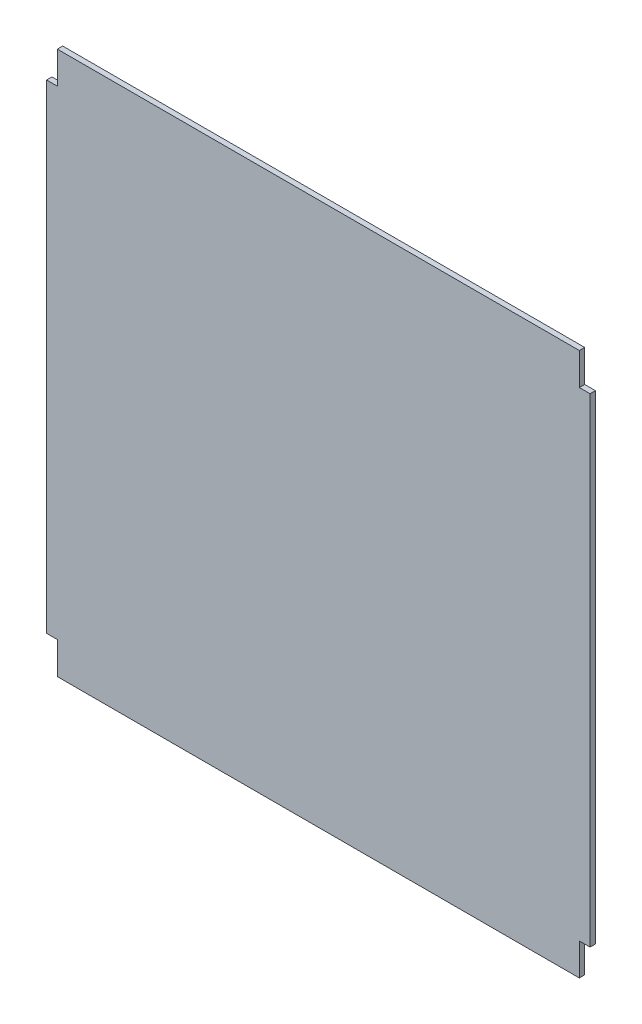
ISO-10303-21;
HEADER;
FILE_DESCRIPTION(('STEP AP214'),'2;1');
FILE_NAME('part.step','',(''),(''),'','','');
FILE_SCHEMA(('AUTOMOTIVE_DESIGN { 1 0 10303 214 1 1 1 1 }'));
ENDSEC;
DATA;
#1=APPLICATION_CONTEXT('core data for automotive mechanical design processes');
#2=APPLICATION_PROTOCOL_DEFINITION('international standard','automotive_design',2000,#1);
#3=PRODUCT_CONTEXT('',#1,'mechanical');
#4=PRODUCT('Part','Part','',(#3));
#5=PRODUCT_RELATED_PRODUCT_CATEGORY('part','',(#4));
#6=PRODUCT_DEFINITION_FORMATION('','',#4);
#7=PRODUCT_DEFINITION_CONTEXT('part definition',#1,'design');
#8=PRODUCT_DEFINITION('design','',#6,#7);
#9=PRODUCT_DEFINITION_SHAPE('','',#8);
#10=(LENGTH_UNIT() NAMED_UNIT(*) SI_UNIT(.MILLI.,.METRE.));
#11=(NAMED_UNIT(*) PLANE_ANGLE_UNIT() SI_UNIT($,.RADIAN.));
#12=(NAMED_UNIT(*) SI_UNIT($,.STERADIAN.) SOLID_ANGLE_UNIT());
#13=UNCERTAINTY_MEASURE_WITH_UNIT(LENGTH_MEASURE(1.E-05),#10,'distance_accuracy_value','');
#14=(GEOMETRIC_REPRESENTATION_CONTEXT(3) GLOBAL_UNCERTAINTY_ASSIGNED_CONTEXT((#13)) GLOBAL_UNIT_ASSIGNED_CONTEXT((#10,
#11,#12)) REPRESENTATION_CONTEXT('',''));
#15=CARTESIAN_POINT('',(0.,0.,0.));
#16=DIRECTION('',(0.,0.,1.));
#17=DIRECTION('',(1.,0.,0.));
#18=AXIS2_PLACEMENT_3D('',#15,#16,#17);
#19=CARTESIAN_POINT('',(0.,0.,4.));
#20=DIRECTION('',(-1.,0.,0.));
#21=DIRECTION('',(0.,-1.,0.));
#22=AXIS2_PLACEMENT_3D('',#19,#20,#21);
#23=PLANE('',#22);
#24=DIRECTION('',(0.,1.,0.));
#25=VECTOR('',#24,1.);
#26=CARTESIAN_POINT('',(0.,508.,5.));
#27=LINE('',#26,#25);
#28=CARTESIAN_POINT('',(0.,30.,5.));
#29=VERTEX_POINT('',#28);
#30=CARTESIAN_POINT('',(0.,478.,5.));
#31=VERTEX_POINT('',#30);
#32=EDGE_CURVE('E172',#29,#31,#27,.T.);
#33=ORIENTED_EDGE('',*,*,#32,.F.);
#34=DIRECTION('',(0.,0.,-1.));
#35=VECTOR('',#34,1.);
#36=CARTESIAN_POINT('',(0.,30.,5.));
#37=LINE('',#36,#35);
#38=CARTESIAN_POINT('',(0.,30.,0.));
#39=VERTEX_POINT('',#38);
#40=EDGE_CURVE('E252',#29,#39,#37,.T.);
#41=ORIENTED_EDGE('',*,*,#40,.T.);
#42=DIRECTION('',(0.,1.,0.));
#43=VECTOR('',#42,1.);
#44=CARTESIAN_POINT('',(0.,0.,0.));
#45=LINE('',#44,#43);
#46=CARTESIAN_POINT('',(0.,478.,0.));
#47=VERTEX_POINT('',#46);
#48=EDGE_CURVE('E206',#39,#47,#45,.T.);
#49=ORIENTED_EDGE('',*,*,#48,.T.);
#50=DIRECTION('',(0.,0.,-1.));
#51=VECTOR('',#50,1.);
#52=CARTESIAN_POINT('',(0.,478.,5.));
#53=LINE('',#52,#51);
#54=EDGE_CURVE('E278',#31,#47,#53,.T.);
#55=ORIENTED_EDGE('',*,*,#54,.F.);
#56=EDGE_LOOP('',(#33,#41,#49,#55));
#57=FACE_BOUND('',#56,.T.);
#58=ADVANCED_FACE('F33',(#57),#23,.F.);
#59=CARTESIAN_POINT('',(0.,508.,4.));
#60=DIRECTION('',(0.,-1.,0.));
#61=DIRECTION('',(1.,0.,0.));
#62=AXIS2_PLACEMENT_3D('',#59,#60,#61);
#63=PLANE('',#62);
#64=DIRECTION('',(-1.,0.,0.));
#65=VECTOR('',#64,1.);
#66=CARTESIAN_POINT('',(0.,508.,0.));
#67=LINE('',#66,#65);
#68=CARTESIAN_POINT('',(-10.,508.,0.));
#69=VERTEX_POINT('',#68);
#70=CARTESIAN_POINT('',(-498.,508.,0.));
#71=VERTEX_POINT('',#70);
#72=EDGE_CURVE('E165',#69,#71,#67,.T.);
#73=ORIENTED_EDGE('',*,*,#72,.T.);
#74=DIRECTION('',(0.,0.,-1.));
#75=VECTOR('',#74,1.);
#76=CARTESIAN_POINT('',(-498.,508.,5.));
#77=LINE('',#76,#75);
#78=CARTESIAN_POINT('',(-498.,508.,5.));
#79=VERTEX_POINT('',#78);
#80=EDGE_CURVE('E149',#79,#71,#77,.T.);
#81=ORIENTED_EDGE('',*,*,#80,.F.);
#82=DIRECTION('',(-1.,0.,0.));
#83=VECTOR('',#82,1.);
#84=CARTESIAN_POINT('',(-508.,508.,5.));
#85=LINE('',#84,#83);
#86=CARTESIAN_POINT('',(-10.,508.,5.));
#87=VERTEX_POINT('',#86);
#88=EDGE_CURVE('E163',#87,#79,#85,.T.);
#89=ORIENTED_EDGE('',*,*,#88,.F.);
#90=DIRECTION('',(0.,0.,-1.));
#91=VECTOR('',#90,1.);
#92=CARTESIAN_POINT('',(-10.,508.,5.));
#93=LINE('',#92,#91);
#94=EDGE_CURVE('E281',#87,#69,#93,.T.);
#95=ORIENTED_EDGE('',*,*,#94,.T.);
#96=EDGE_LOOP('',(#73,#81,#89,#95));
#97=FACE_BOUND('',#96,.T.);
#98=ADVANCED_FACE('F161',(#97),#63,.F.);
#99=CARTESIAN_POINT('',(-508.,0.,4.));
#100=DIRECTION('',(-1.,0.,0.));
#101=DIRECTION('',(0.,0.,1.));
#102=AXIS2_PLACEMENT_3D('',#99,#100,#101);
#103=PLANE('',#102);
#104=DIRECTION('',(0.,0.,-1.));
#105=VECTOR('',#104,1.);
#106=CARTESIAN_POINT('',(-508.,30.,5.));
#107=LINE('',#106,#105);
#108=CARTESIAN_POINT('',(-508.,30.,5.));
#109=VERTEX_POINT('',#108);
#110=CARTESIAN_POINT('',(-508.,30.,0.));
#111=VERTEX_POINT('',#110);
#112=EDGE_CURVE('E232',#109,#111,#107,.T.);
#113=ORIENTED_EDGE('',*,*,#112,.F.);
#114=DIRECTION('',(0.,-1.,0.));
#115=VECTOR('',#114,1.);
#116=CARTESIAN_POINT('',(-508.,508.,5.));
#117=LINE('',#116,#115);
#118=CARTESIAN_POINT('',(-508.,478.,5.));
#119=VERTEX_POINT('',#118);
#120=EDGE_CURVE('E235',#119,#109,#117,.T.);
#121=ORIENTED_EDGE('',*,*,#120,.F.);
#122=DIRECTION('',(0.,0.,-1.));
#123=VECTOR('',#122,1.);
#124=CARTESIAN_POINT('',(-508.,478.,5.));
#125=LINE('',#124,#123);
#126=CARTESIAN_POINT('',(-508.,478.,0.));
#127=VERTEX_POINT('',#126);
#128=EDGE_CURVE('E234',#119,#127,#125,.T.);
#129=ORIENTED_EDGE('',*,*,#128,.T.);
#130=DIRECTION('',(0.,1.,0.));
#131=VECTOR('',#130,1.);
#132=CARTESIAN_POINT('',(-508.,0.,0.));
#133=LINE('',#132,#131);
#134=EDGE_CURVE('E40',#111,#127,#133,.T.);
#135=ORIENTED_EDGE('',*,*,#134,.F.);
#136=EDGE_LOOP('',(#113,#121,#129,#135));
#137=FACE_BOUND('',#136,.T.);
#138=ADVANCED_FACE('F230',(#137),#103,.T.);
#139=CARTESIAN_POINT('',(0.,0.,4.));
#140=DIRECTION('',(0.,-1.,0.));
#141=DIRECTION('',(0.,0.,-1.));
#142=AXIS2_PLACEMENT_3D('',#139,#140,#141);
#143=PLANE('',#142);
#144=DIRECTION('',(0.,0.,-1.));
#145=VECTOR('',#144,1.);
#146=CARTESIAN_POINT('',(-10.,0.,5.));
#147=LINE('',#146,#145);
#148=CARTESIAN_POINT('',(-10.,0.,5.));
#149=VERTEX_POINT('',#148);
#150=CARTESIAN_POINT('',(-10.,0.,0.));
#151=VERTEX_POINT('',#150);
#152=EDGE_CURVE('E266',#149,#151,#147,.T.);
#153=ORIENTED_EDGE('',*,*,#152,.F.);
#154=DIRECTION('',(1.,0.,0.));
#155=VECTOR('',#154,1.);
#156=CARTESIAN_POINT('',(-508.,0.,5.));
#157=LINE('',#156,#155);
#158=CARTESIAN_POINT('',(-498.,0.,5.));
#159=VERTEX_POINT('',#158);
#160=EDGE_CURVE('E178',#159,#149,#157,.T.);
#161=ORIENTED_EDGE('',*,*,#160,.F.);
#162=DIRECTION('',(0.,0.,-1.));
#163=VECTOR('',#162,1.);
#164=CARTESIAN_POINT('',(-498.,0.,5.));
#165=LINE('',#164,#163);
#166=CARTESIAN_POINT('',(-498.,0.,0.));
#167=VERTEX_POINT('',#166);
#168=EDGE_CURVE('E254',#159,#167,#165,.T.);
#169=ORIENTED_EDGE('',*,*,#168,.T.);
#170=DIRECTION('',(-1.,0.,0.));
#171=VECTOR('',#170,1.);
#172=CARTESIAN_POINT('',(0.,0.,0.));
#173=LINE('',#172,#171);
#174=EDGE_CURVE('E11',#151,#167,#173,.T.);
#175=ORIENTED_EDGE('',*,*,#174,.F.);
#176=EDGE_LOOP('',(#153,#161,#169,#175));
#177=FACE_BOUND('',#176,.T.);
#178=ADVANCED_FACE('F290',(#177),#143,.T.);
#179=CARTESIAN_POINT('',(0.,0.,0.));
#180=DIRECTION('',(0.,0.,1.));
#181=DIRECTION('',(1.,0.,0.));
#182=AXIS2_PLACEMENT_3D('',#179,#180,#181);
#183=PLANE('',#182);
#184=DIRECTION('',(1.,0.,0.));
#185=VECTOR('',#184,1.);
#186=CARTESIAN_POINT('',(-50.7999999999999,50.8,0.));
#187=LINE('',#186,#185);
#188=CARTESIAN_POINT('',(-457.2,50.8,0.));
#189=VERTEX_POINT('',#188);
#190=CARTESIAN_POINT('',(-50.7999999999999,50.8,0.));
#191=VERTEX_POINT('',#190);
#192=EDGE_CURVE('E192',#189,#191,#187,.T.);
#193=ORIENTED_EDGE('',*,*,#192,.T.);
#194=DIRECTION('',(0.,1.,0.));
#195=VECTOR('',#194,1.);
#196=CARTESIAN_POINT('',(-50.8,457.2,0.));
#197=LINE('',#196,#195);
#198=CARTESIAN_POINT('',(-50.8,457.2,0.));
#199=VERTEX_POINT('',#198);
#200=EDGE_CURVE('E182',#191,#199,#197,.T.);
#201=ORIENTED_EDGE('',*,*,#200,.T.);
#202=DIRECTION('',(-1.,0.,0.));
#203=VECTOR('',#202,1.);
#204=CARTESIAN_POINT('',(-50.8,457.2,0.));
#205=LINE('',#204,#203);
#206=CARTESIAN_POINT('',(-457.2,457.2,0.));
#207=VERTEX_POINT('',#206);
#208=EDGE_CURVE('E185',#199,#207,#205,.T.);
#209=ORIENTED_EDGE('',*,*,#208,.T.);
#210=DIRECTION('',(0.,-1.,0.));
#211=VECTOR('',#210,1.);
#212=CARTESIAN_POINT('',(-457.2,457.2,0.));
#213=LINE('',#212,#211);
#214=EDGE_CURVE('E189',#207,#189,#213,.T.);
#215=ORIENTED_EDGE('',*,*,#214,.T.);
#216=EDGE_LOOP('',(#193,#201,#209,#215));
#217=FACE_BOUND('',#216,.T.);
#218=ORIENTED_EDGE('',*,*,#48,.F.);
#219=DIRECTION('',(1.,0.,0.));
#220=VECTOR('',#219,1.);
#221=CARTESIAN_POINT('',(0.,30.,0.));
#222=LINE('',#221,#220);
#223=CARTESIAN_POINT('',(-9.99999999999999,30.,0.));
#224=VERTEX_POINT('',#223);
#225=EDGE_CURVE('E264',#224,#39,#222,.T.);
#226=ORIENTED_EDGE('',*,*,#225,.F.);
#227=DIRECTION('',(0.,1.,0.));
#228=VECTOR('',#227,1.);
#229=CARTESIAN_POINT('',(-10.,0.,0.));
#230=LINE('',#229,#228);
#231=EDGE_CURVE('E267',#151,#224,#230,.T.);
#232=ORIENTED_EDGE('',*,*,#231,.F.);
#233=ORIENTED_EDGE('',*,*,#174,.T.);
#234=DIRECTION('',(0.,-1.,0.));
#235=VECTOR('',#234,1.);
#236=CARTESIAN_POINT('',(-498.,0.,0.));
#237=LINE('',#236,#235);
#238=CARTESIAN_POINT('',(-498.,30.,0.));
#239=VERTEX_POINT('',#238);
#240=EDGE_CURVE('E249',#239,#167,#237,.T.);
#241=ORIENTED_EDGE('',*,*,#240,.F.);
#242=DIRECTION('',(1.,0.,0.));
#243=VECTOR('',#242,1.);
#244=CARTESIAN_POINT('',(-508.,30.,0.));
#245=LINE('',#244,#243);
#246=EDGE_CURVE('E226',#111,#239,#245,.T.);
#247=ORIENTED_EDGE('',*,*,#246,.F.);
#248=ORIENTED_EDGE('',*,*,#134,.T.);
#249=DIRECTION('',(-1.,0.,0.));
#250=VECTOR('',#249,1.);
#251=CARTESIAN_POINT('',(-508.,478.,0.));
#252=LINE('',#251,#250);
#253=CARTESIAN_POINT('',(-498.,478.,0.));
#254=VERTEX_POINT('',#253);
#255=EDGE_CURVE('E156',#254,#127,#252,.T.);
#256=ORIENTED_EDGE('',*,*,#255,.F.);
#257=DIRECTION('',(0.,-1.,0.));
#258=VECTOR('',#257,1.);
#259=CARTESIAN_POINT('',(-498.,508.,0.));
#260=LINE('',#259,#258);
#261=EDGE_CURVE('E257',#71,#254,#260,.T.);
#262=ORIENTED_EDGE('',*,*,#261,.F.);
#263=ORIENTED_EDGE('',*,*,#72,.F.);
#264=DIRECTION('',(0.,1.,0.));
#265=VECTOR('',#264,1.);
#266=CARTESIAN_POINT('',(-10.,508.,0.));
#267=LINE('',#266,#265);
#268=CARTESIAN_POINT('',(-10.,478.,0.));
#269=VERTEX_POINT('',#268);
#270=EDGE_CURVE('E240',#269,#69,#267,.T.);
#271=ORIENTED_EDGE('',*,*,#270,.F.);
#272=DIRECTION('',(-1.,0.,0.));
#273=VECTOR('',#272,1.);
#274=CARTESIAN_POINT('',(0.,478.,0.));
#275=LINE('',#274,#273);
#276=EDGE_CURVE('E237',#47,#269,#275,.T.);
#277=ORIENTED_EDGE('',*,*,#276,.F.);
#278=EDGE_LOOP('',(#218,#226,#232,#233,#241,#247,#248,#256,#262,#263,#271,#277));
#279=FACE_BOUND('',#278,.T.);
#280=ADVANCED_FACE('F223',(#217,#279),#183,.F.);
#281=CARTESIAN_POINT('',(-50.8,457.2,0.));
#282=DIRECTION('',(1.,0.,0.));
#283=DIRECTION('',(0.,1.,0.));
#284=AXIS2_PLACEMENT_3D('',#281,#282,#283);
#285=PLANE('',#284);
#286=DIRECTION('',(0.,1.,0.));
#287=VECTOR('',#286,1.);
#288=CARTESIAN_POINT('',(-50.8,457.2,4.));
#289=LINE('',#288,#287);
#290=CARTESIAN_POINT('',(-50.7999999999999,50.8,4.));
#291=VERTEX_POINT('',#290);
#292=CARTESIAN_POINT('',(-50.8,457.2,4.));
#293=VERTEX_POINT('',#292);
#294=EDGE_CURVE('E171',#291,#293,#289,.T.);
#295=ORIENTED_EDGE('',*,*,#294,.T.);
#296=DIRECTION('',(0.,0.,1.));
#297=VECTOR('',#296,1.);
#298=CARTESIAN_POINT('',(-50.8,457.2,0.));
#299=LINE('',#298,#297);
#300=EDGE_CURVE('E194',#199,#293,#299,.T.);
#301=ORIENTED_EDGE('',*,*,#300,.F.);
#302=ORIENTED_EDGE('',*,*,#200,.F.);
#303=DIRECTION('',(0.,0.,1.));
#304=VECTOR('',#303,1.);
#305=CARTESIAN_POINT('',(-50.7999999999999,50.8,0.));
#306=LINE('',#305,#304);
#307=EDGE_CURVE('E203',#191,#291,#306,.T.);
#308=ORIENTED_EDGE('',*,*,#307,.T.);
#309=EDGE_LOOP('',(#295,#301,#302,#308));
#310=FACE_BOUND('',#309,.T.);
#311=ADVANCED_FACE('F332',(#310),#285,.F.);
#312=CARTESIAN_POINT('',(-50.7999999999999,50.8,0.));
#313=DIRECTION('',(0.,-1.,0.));
#314=DIRECTION('',(1.,0.,0.));
#315=AXIS2_PLACEMENT_3D('',#312,#313,#314);
#316=PLANE('',#315);
#317=DIRECTION('',(1.,0.,0.));
#318=VECTOR('',#317,1.);
#319=CARTESIAN_POINT('',(-50.7999999999999,50.8,4.));
#320=LINE('',#319,#318);
#321=CARTESIAN_POINT('',(-457.2,50.8,4.));
#322=VERTEX_POINT('',#321);
#323=EDGE_CURVE('E186',#322,#291,#320,.T.);
#324=ORIENTED_EDGE('',*,*,#323,.T.);
#325=ORIENTED_EDGE('',*,*,#307,.F.);
#326=ORIENTED_EDGE('',*,*,#192,.F.);
#327=DIRECTION('',(0.,0.,1.));
#328=VECTOR('',#327,1.);
#329=CARTESIAN_POINT('',(-457.2,50.8,0.));
#330=LINE('',#329,#328);
#331=EDGE_CURVE('E207',#189,#322,#330,.T.);
#332=ORIENTED_EDGE('',*,*,#331,.T.);
#333=EDGE_LOOP('',(#324,#325,#326,#332));
#334=FACE_BOUND('',#333,.T.);
#335=ADVANCED_FACE('F336',(#334),#316,.F.);
#336=CARTESIAN_POINT('',(-457.2,457.2,0.));
#337=DIRECTION('',(-1.,0.,0.));
#338=DIRECTION('',(0.,-1.,0.));
#339=AXIS2_PLACEMENT_3D('',#336,#337,#338);
#340=PLANE('',#339);
#341=DIRECTION('',(0.,-1.,0.));
#342=VECTOR('',#341,1.);
#343=CARTESIAN_POINT('',(-457.2,457.2,4.));
#344=LINE('',#343,#342);
#345=CARTESIAN_POINT('',(-457.2,457.2,4.));
#346=VERTEX_POINT('',#345);
#347=EDGE_CURVE('E198',#346,#322,#344,.T.);
#348=ORIENTED_EDGE('',*,*,#347,.T.);
#349=ORIENTED_EDGE('',*,*,#331,.F.);
#350=ORIENTED_EDGE('',*,*,#214,.F.);
#351=DIRECTION('',(0.,0.,1.));
#352=VECTOR('',#351,1.);
#353=CARTESIAN_POINT('',(-457.2,457.2,0.));
#354=LINE('',#353,#352);
#355=EDGE_CURVE('E210',#207,#346,#354,.T.);
#356=ORIENTED_EDGE('',*,*,#355,.T.);
#357=EDGE_LOOP('',(#348,#349,#350,#356));
#358=FACE_BOUND('',#357,.T.);
#359=ADVANCED_FACE('F342',(#358),#340,.F.);
#360=CARTESIAN_POINT('',(-50.8,457.2,0.));
#361=DIRECTION('',(0.,1.,0.));
#362=DIRECTION('',(-1.,0.,0.));
#363=AXIS2_PLACEMENT_3D('',#360,#361,#362);
#364=PLANE('',#363);
#365=DIRECTION('',(-1.,0.,0.));
#366=VECTOR('',#365,1.);
#367=CARTESIAN_POINT('',(-50.8,457.2,4.));
#368=LINE('',#367,#366);
#369=EDGE_CURVE('E175',#293,#346,#368,.T.);
#370=ORIENTED_EDGE('',*,*,#369,.T.);
#371=ORIENTED_EDGE('',*,*,#355,.F.);
#372=ORIENTED_EDGE('',*,*,#208,.F.);
#373=ORIENTED_EDGE('',*,*,#300,.T.);
#374=EDGE_LOOP('',(#370,#371,#372,#373));
#375=FACE_BOUND('',#374,.T.);
#376=ADVANCED_FACE('F338',(#375),#364,.F.);
#377=CARTESIAN_POINT('',(0.,0.,4.));
#378=DIRECTION('',(0.,0.,1.));
#379=DIRECTION('',(1.,0.,0.));
#380=AXIS2_PLACEMENT_3D('',#377,#378,#379);
#381=PLANE('',#380);
#382=ORIENTED_EDGE('',*,*,#294,.F.);
#383=ORIENTED_EDGE('',*,*,#323,.F.);
#384=ORIENTED_EDGE('',*,*,#347,.F.);
#385=ORIENTED_EDGE('',*,*,#369,.F.);
#386=EDGE_LOOP('',(#382,#383,#384,#385));
#387=FACE_BOUND('',#386,.T.);
#388=ADVANCED_FACE('F341',(#387),#381,.F.);
#389=CARTESIAN_POINT('',(0.,0.,5.));
#390=DIRECTION('',(0.,0.,1.));
#391=DIRECTION('',(1.,0.,0.));
#392=AXIS2_PLACEMENT_3D('',#389,#390,#391);
#393=PLANE('',#392);
#394=DIRECTION('',(1.,0.,0.));
#395=VECTOR('',#394,1.);
#396=CARTESIAN_POINT('',(0.,30.,5.));
#397=LINE('',#396,#395);
#398=CARTESIAN_POINT('',(-9.99999999999999,30.,5.));
#399=VERTEX_POINT('',#398);
#400=EDGE_CURVE('E47',#399,#29,#397,.T.);
#401=ORIENTED_EDGE('',*,*,#400,.T.);
#402=ORIENTED_EDGE('',*,*,#32,.T.);
#403=DIRECTION('',(-1.,0.,0.));
#404=VECTOR('',#403,1.);
#405=CARTESIAN_POINT('',(0.,478.,5.));
#406=LINE('',#405,#404);
#407=CARTESIAN_POINT('',(-10.,478.,5.));
#408=VERTEX_POINT('',#407);
#409=EDGE_CURVE('E276',#31,#408,#406,.T.);
#410=ORIENTED_EDGE('',*,*,#409,.T.);
#411=DIRECTION('',(0.,1.,0.));
#412=VECTOR('',#411,1.);
#413=CARTESIAN_POINT('',(-10.,508.,5.));
#414=LINE('',#413,#412);
#415=EDGE_CURVE('E170',#408,#87,#414,.T.);
#416=ORIENTED_EDGE('',*,*,#415,.T.);
#417=ORIENTED_EDGE('',*,*,#88,.T.);
#418=DIRECTION('',(0.,-1.,0.));
#419=VECTOR('',#418,1.);
#420=CARTESIAN_POINT('',(-498.,508.,5.));
#421=LINE('',#420,#419);
#422=CARTESIAN_POINT('',(-498.,478.,5.));
#423=VERTEX_POINT('',#422);
#424=EDGE_CURVE('E145',#79,#423,#421,.T.);
#425=ORIENTED_EDGE('',*,*,#424,.T.);
#426=DIRECTION('',(-1.,0.,0.));
#427=VECTOR('',#426,1.);
#428=CARTESIAN_POINT('',(-508.,478.,5.));
#429=LINE('',#428,#427);
#430=EDGE_CURVE('E155',#423,#119,#429,.T.);
#431=ORIENTED_EDGE('',*,*,#430,.T.);
#432=ORIENTED_EDGE('',*,*,#120,.T.);
#433=DIRECTION('',(1.,0.,0.));
#434=VECTOR('',#433,1.);
#435=CARTESIAN_POINT('',(-508.,30.,5.));
#436=LINE('',#435,#434);
#437=CARTESIAN_POINT('',(-498.,30.,5.));
#438=VERTEX_POINT('',#437);
#439=EDGE_CURVE('E246',#109,#438,#436,.T.);
#440=ORIENTED_EDGE('',*,*,#439,.T.);
#441=DIRECTION('',(0.,-1.,0.));
#442=VECTOR('',#441,1.);
#443=CARTESIAN_POINT('',(-498.,0.,5.));
#444=LINE('',#443,#442);
#445=EDGE_CURVE('E55',#438,#159,#444,.T.);
#446=ORIENTED_EDGE('',*,*,#445,.T.);
#447=ORIENTED_EDGE('',*,*,#160,.T.);
#448=DIRECTION('',(0.,1.,0.));
#449=VECTOR('',#448,1.);
#450=CARTESIAN_POINT('',(-10.,0.,5.));
#451=LINE('',#450,#449);
#452=EDGE_CURVE('E261',#149,#399,#451,.T.);
#453=ORIENTED_EDGE('',*,*,#452,.T.);
#454=EDGE_LOOP('',(#401,#402,#410,#416,#417,#425,#431,#432,#440,#446,#447,#453));
#455=FACE_BOUND('',#454,.T.);
#456=ADVANCED_FACE('F168',(#455),#393,.T.);
#457=CARTESIAN_POINT('',(-10.,508.,5.));
#458=DIRECTION('',(-1.,0.,0.));
#459=DIRECTION('',(0.,-1.,0.));
#460=AXIS2_PLACEMENT_3D('',#457,#458,#459);
#461=PLANE('',#460);
#462=ORIENTED_EDGE('',*,*,#270,.T.);
#463=ORIENTED_EDGE('',*,*,#94,.F.);
#464=ORIENTED_EDGE('',*,*,#415,.F.);
#465=DIRECTION('',(0.,0.,-1.));
#466=VECTOR('',#465,1.);
#467=CARTESIAN_POINT('',(-10.,478.,5.));
#468=LINE('',#467,#466);
#469=EDGE_CURVE('E283',#408,#269,#468,.T.);
#470=ORIENTED_EDGE('',*,*,#469,.T.);
#471=EDGE_LOOP('',(#462,#463,#464,#470));
#472=FACE_BOUND('',#471,.T.);
#473=ADVANCED_FACE('F306',(#472),#461,.F.);
#474=CARTESIAN_POINT('',(0.,478.,5.));
#475=DIRECTION('',(0.,-1.,0.));
#476=DIRECTION('',(0.,0.,-1.));
#477=AXIS2_PLACEMENT_3D('',#474,#475,#476);
#478=PLANE('',#477);
#479=ORIENTED_EDGE('',*,*,#276,.T.);
#480=ORIENTED_EDGE('',*,*,#469,.F.);
#481=ORIENTED_EDGE('',*,*,#409,.F.);
#482=ORIENTED_EDGE('',*,*,#54,.T.);
#483=EDGE_LOOP('',(#479,#480,#481,#482));
#484=FACE_BOUND('',#483,.T.);
#485=ADVANCED_FACE('F303',(#484),#478,.F.);
#486=CARTESIAN_POINT('',(-508.,478.,5.));
#487=DIRECTION('',(0.,-1.,0.));
#488=DIRECTION('',(0.,0.,-1.));
#489=AXIS2_PLACEMENT_3D('',#486,#487,#488);
#490=PLANE('',#489);
#491=ORIENTED_EDGE('',*,*,#255,.T.);
#492=ORIENTED_EDGE('',*,*,#128,.F.);
#493=ORIENTED_EDGE('',*,*,#430,.F.);
#494=DIRECTION('',(0.,0.,-1.));
#495=VECTOR('',#494,1.);
#496=CARTESIAN_POINT('',(-498.,478.,5.));
#497=LINE('',#496,#495);
#498=EDGE_CURVE('E151',#423,#254,#497,.T.);
#499=ORIENTED_EDGE('',*,*,#498,.T.);
#500=EDGE_LOOP('',(#491,#492,#493,#499));
#501=FACE_BOUND('',#500,.T.);
#502=ADVANCED_FACE('F308',(#501),#490,.F.);
#503=CARTESIAN_POINT('',(-498.,508.,5.));
#504=DIRECTION('',(1.,0.,0.));
#505=DIRECTION('',(0.,0.,-1.));
#506=AXIS2_PLACEMENT_3D('',#503,#504,#505);
#507=PLANE('',#506);
#508=ORIENTED_EDGE('',*,*,#261,.T.);
#509=ORIENTED_EDGE('',*,*,#498,.F.);
#510=ORIENTED_EDGE('',*,*,#424,.F.);
#511=ORIENTED_EDGE('',*,*,#80,.T.);
#512=EDGE_LOOP('',(#508,#509,#510,#511));
#513=FACE_BOUND('',#512,.T.);
#514=ADVANCED_FACE('F148',(#513),#507,.F.);
#515=CARTESIAN_POINT('',(-498.,0.,5.));
#516=DIRECTION('',(1.,0.,0.));
#517=DIRECTION('',(0.,0.,-1.));
#518=AXIS2_PLACEMENT_3D('',#515,#516,#517);
#519=PLANE('',#518);
#520=ORIENTED_EDGE('',*,*,#240,.T.);
#521=ORIENTED_EDGE('',*,*,#168,.F.);
#522=ORIENTED_EDGE('',*,*,#445,.F.);
#523=DIRECTION('',(0.,0.,-1.));
#524=VECTOR('',#523,1.);
#525=CARTESIAN_POINT('',(-498.,30.,5.));
#526=LINE('',#525,#524);
#527=EDGE_CURVE('E258',#438,#239,#526,.T.);
#528=ORIENTED_EDGE('',*,*,#527,.T.);
#529=EDGE_LOOP('',(#520,#521,#522,#528));
#530=FACE_BOUND('',#529,.T.);
#531=ADVANCED_FACE('F315',(#530),#519,.F.);
#532=CARTESIAN_POINT('',(-508.,30.,5.));
#533=DIRECTION('',(0.,1.,0.));
#534=DIRECTION('',(0.,0.,1.));
#535=AXIS2_PLACEMENT_3D('',#532,#533,#534);
#536=PLANE('',#535);
#537=ORIENTED_EDGE('',*,*,#246,.T.);
#538=ORIENTED_EDGE('',*,*,#527,.F.);
#539=ORIENTED_EDGE('',*,*,#439,.F.);
#540=ORIENTED_EDGE('',*,*,#112,.T.);
#541=EDGE_LOOP('',(#537,#538,#539,#540));
#542=FACE_BOUND('',#541,.T.);
#543=ADVANCED_FACE('F361',(#542),#536,.F.);
#544=CARTESIAN_POINT('',(0.,30.,5.));
#545=DIRECTION('',(0.,1.,0.));
#546=DIRECTION('',(0.,0.,1.));
#547=AXIS2_PLACEMENT_3D('',#544,#545,#546);
#548=PLANE('',#547);
#549=ORIENTED_EDGE('',*,*,#225,.T.);
#550=ORIENTED_EDGE('',*,*,#40,.F.);
#551=ORIENTED_EDGE('',*,*,#400,.F.);
#552=DIRECTION('',(0.,0.,-1.));
#553=VECTOR('',#552,1.);
#554=CARTESIAN_POINT('',(-9.99999999999999,30.,5.));
#555=LINE('',#554,#553);
#556=EDGE_CURVE('E273',#399,#224,#555,.T.);
#557=ORIENTED_EDGE('',*,*,#556,.T.);
#558=EDGE_LOOP('',(#549,#550,#551,#557));
#559=FACE_BOUND('',#558,.T.);
#560=ADVANCED_FACE('F297',(#559),#548,.F.);
#561=CARTESIAN_POINT('',(-10.,0.,5.));
#562=DIRECTION('',(-1.,0.,0.));
#563=DIRECTION('',(0.,-1.,0.));
#564=AXIS2_PLACEMENT_3D('',#561,#562,#563);
#565=PLANE('',#564);
#566=ORIENTED_EDGE('',*,*,#231,.T.);
#567=ORIENTED_EDGE('',*,*,#556,.F.);
#568=ORIENTED_EDGE('',*,*,#452,.F.);
#569=ORIENTED_EDGE('',*,*,#152,.T.);
#570=EDGE_LOOP('',(#566,#567,#568,#569));
#571=FACE_BOUND('',#570,.T.);
#572=ADVANCED_FACE('F294',(#571),#565,.F.);
#573=CLOSED_SHELL('',(#58,#98,#138,#178,#280,#311,#335,#359,#376,#388,#456,#473,#485,#502,#514,
#531,#543,#560,#572));
#574=MANIFOLD_SOLID_BREP('B2',#573);
#575=ADVANCED_BREP_SHAPE_REPRESENTATION('',(#18,#574),#14);
#576=SHAPE_DEFINITION_REPRESENTATION(#9,#575);
ENDSEC;
END-ISO-10303-21;
